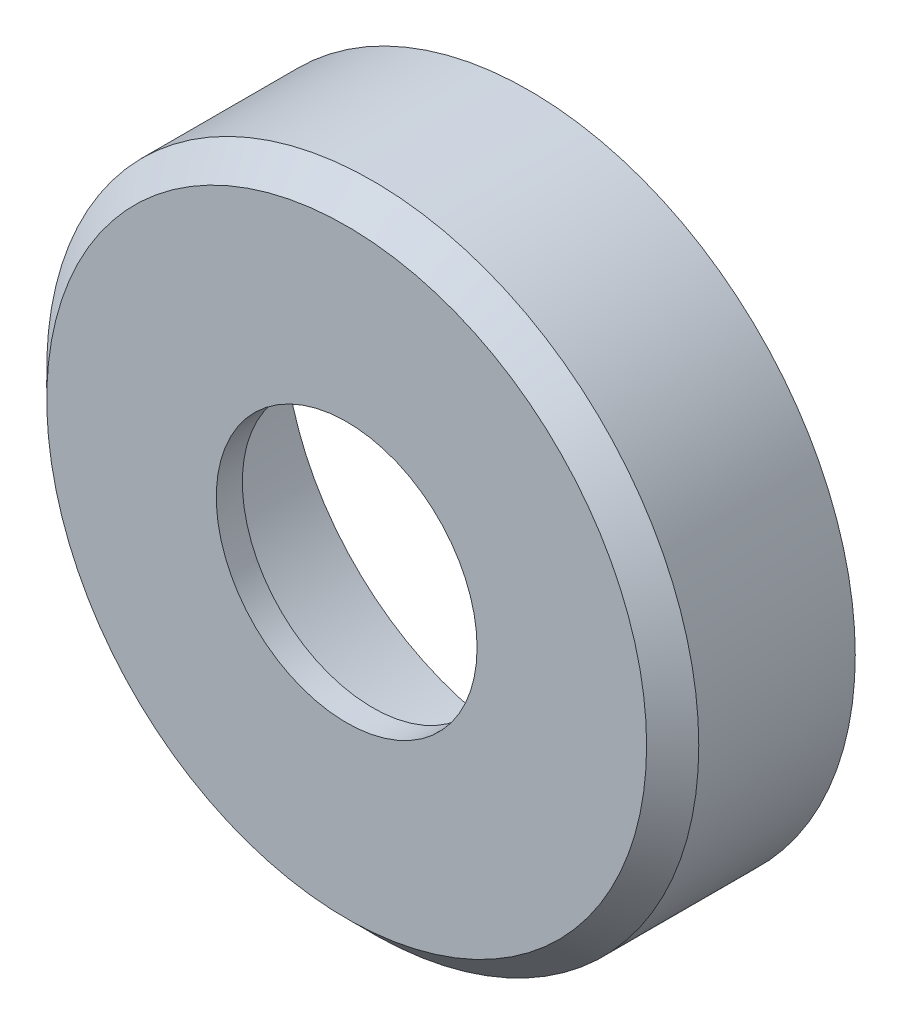
ISO-10303-21;
HEADER;
FILE_DESCRIPTION(('STEP AP214'),'2;1');
FILE_NAME('part.step','',(''),(''),'','','');
FILE_SCHEMA(('AUTOMOTIVE_DESIGN { 1 0 10303 214 1 1 1 1 }'));
ENDSEC;
DATA;
#1=APPLICATION_CONTEXT('core data for automotive mechanical design processes');
#2=APPLICATION_PROTOCOL_DEFINITION('international standard','automotive_design',2000,#1);
#3=PRODUCT_CONTEXT('',#1,'mechanical');
#4=PRODUCT('Part','Part','',(#3));
#5=PRODUCT_RELATED_PRODUCT_CATEGORY('part','',(#4));
#6=PRODUCT_DEFINITION_FORMATION('','',#4);
#7=PRODUCT_DEFINITION_CONTEXT('part definition',#1,'design');
#8=PRODUCT_DEFINITION('design','',#6,#7);
#9=PRODUCT_DEFINITION_SHAPE('','',#8);
#10=(LENGTH_UNIT() NAMED_UNIT(*) SI_UNIT(.MILLI.,.METRE.));
#11=(NAMED_UNIT(*) PLANE_ANGLE_UNIT() SI_UNIT($,.RADIAN.));
#12=(NAMED_UNIT(*) SI_UNIT($,.STERADIAN.) SOLID_ANGLE_UNIT());
#13=UNCERTAINTY_MEASURE_WITH_UNIT(LENGTH_MEASURE(1.E-05),#10,'distance_accuracy_value','');
#14=(GEOMETRIC_REPRESENTATION_CONTEXT(3) GLOBAL_UNCERTAINTY_ASSIGNED_CONTEXT((#13)) GLOBAL_UNIT_ASSIGNED_CONTEXT((#10,
#11,#12)) REPRESENTATION_CONTEXT('',''));
#15=CARTESIAN_POINT('',(0.,0.,0.));
#16=DIRECTION('',(0.,0.,1.));
#17=DIRECTION('',(1.,0.,0.));
#18=AXIS2_PLACEMENT_3D('',#15,#16,#17);
#19=CARTESIAN_POINT('',(0.,0.,0.));
#20=DIRECTION('',(0.,0.,1.));
#21=DIRECTION('',(1.,0.,0.));
#22=AXIS2_PLACEMENT_3D('',#19,#20,#21);
#23=PLANE('',#22);
#24=CARTESIAN_POINT('',(0.,0.,0.));
#25=DIRECTION('',(0.,0.,1.));
#26=DIRECTION('',(1.,0.,0.));
#27=AXIS2_PLACEMENT_3D('',#24,#25,#26);
#28=CIRCLE('',#27,12.5);
#29=CARTESIAN_POINT('',(12.5,0.,0.));
#30=VERTEX_POINT('',#29);
#31=EDGE_CURVE('E43',#30,#30,#28,.T.);
#32=ORIENTED_EDGE('',*,*,#31,.F.);
#33=EDGE_LOOP('',(#32));
#34=FACE_BOUND('',#33,.T.);
#35=CARTESIAN_POINT('',(0.,0.,0.));
#36=DIRECTION('',(0.,0.,1.));
#37=DIRECTION('',(1.,0.,0.));
#38=AXIS2_PLACEMENT_3D('',#35,#36,#37);
#39=CIRCLE('',#38,9.4);
#40=CARTESIAN_POINT('',(9.4,0.,0.));
#41=VERTEX_POINT('',#40);
#42=EDGE_CURVE('E47',#41,#41,#39,.T.);
#43=ORIENTED_EDGE('',*,*,#42,.T.);
#44=EDGE_LOOP('',(#43));
#45=FACE_BOUND('',#44,.T.);
#46=ADVANCED_FACE('F32',(#34,#45),#23,.F.);
#47=CARTESIAN_POINT('',(0.,0.,6.));
#48=DIRECTION('',(0.,0.,-1.));
#49=DIRECTION('',(-1.,0.,0.));
#50=AXIS2_PLACEMENT_3D('',#47,#48,#49);
#51=CYLINDRICAL_SURFACE('',#50,12.5);
#52=CARTESIAN_POINT('',(0.,0.,5.99999999999999));
#53=DIRECTION('',(0.,0.,1.));
#54=DIRECTION('',(1.,0.,0.));
#55=AXIS2_PLACEMENT_3D('',#52,#53,#54);
#56=CIRCLE('',#55,12.5);
#57=CARTESIAN_POINT('',(12.5,0.,5.99999999999999));
#58=VERTEX_POINT('',#57);
#59=EDGE_CURVE('E10',#58,#58,#56,.F.);
#60=ORIENTED_EDGE('',*,*,#59,.T.);
#61=EDGE_LOOP('',(#60));
#62=FACE_BOUND('',#61,.T.);
#63=ORIENTED_EDGE('',*,*,#31,.T.);
#64=EDGE_LOOP('',(#63));
#65=FACE_BOUND('',#64,.T.);
#66=ADVANCED_FACE('F78',(#62,#65),#51,.T.);
#67=CARTESIAN_POINT('',(0.,0.,6.));
#68=DIRECTION('',(0.,0.,-1.));
#69=DIRECTION('',(-1.,0.,0.));
#70=AXIS2_PLACEMENT_3D('',#67,#68,#69);
#71=CYLINDRICAL_SURFACE('',#70,9.4);
#72=CARTESIAN_POINT('',(0.,0.,6.));
#73=DIRECTION('',(0.,0.,1.));
#74=DIRECTION('',(1.,0.,0.));
#75=AXIS2_PLACEMENT_3D('',#72,#73,#74);
#76=CIRCLE('',#75,9.4);
#77=CARTESIAN_POINT('',(9.4,0.,6.));
#78=VERTEX_POINT('',#77);
#79=EDGE_CURVE('E52',#78,#78,#76,.T.);
#80=ORIENTED_EDGE('',*,*,#79,.T.);
#81=EDGE_LOOP('',(#80));
#82=FACE_BOUND('',#81,.T.);
#83=ORIENTED_EDGE('',*,*,#42,.F.);
#84=EDGE_LOOP('',(#83));
#85=FACE_BOUND('',#84,.T.);
#86=ADVANCED_FACE('F74',(#82,#85),#71,.F.);
#87=CARTESIAN_POINT('',(0.,0.,6.));
#88=DIRECTION('',(0.,0.,1.));
#89=DIRECTION('',(1.,0.,0.));
#90=AXIS2_PLACEMENT_3D('',#87,#88,#89);
#91=PLANE('',#90);
#92=CARTESIAN_POINT('',(0.,0.,6.));
#93=DIRECTION('',(0.,0.,1.));
#94=DIRECTION('',(1.,0.,0.));
#95=AXIS2_PLACEMENT_3D('',#92,#93,#94);
#96=CIRCLE('',#95,5.);
#97=CARTESIAN_POINT('',(5.,0.,6.));
#98=VERTEX_POINT('',#97);
#99=EDGE_CURVE('E56',#98,#98,#96,.T.);
#100=ORIENTED_EDGE('',*,*,#99,.T.);
#101=EDGE_LOOP('',(#100));
#102=FACE_BOUND('',#101,.T.);
#103=ORIENTED_EDGE('',*,*,#79,.F.);
#104=EDGE_LOOP('',(#103));
#105=FACE_BOUND('',#104,.T.);
#106=ADVANCED_FACE('F67',(#102,#105),#91,.F.);
#107=CARTESIAN_POINT('',(0.,0.,7.));
#108=DIRECTION('',(0.,0.,1.));
#109=DIRECTION('',(1.,0.,0.));
#110=AXIS2_PLACEMENT_3D('',#107,#108,#109);
#111=PLANE('',#110);
#112=CARTESIAN_POINT('',(0.,0.,7.));
#113=DIRECTION('',(0.,0.,1.));
#114=DIRECTION('',(1.,0.,0.));
#115=AXIS2_PLACEMENT_3D('',#112,#113,#114);
#116=CIRCLE('',#115,11.5);
#117=CARTESIAN_POINT('',(11.5,0.,7.));
#118=VERTEX_POINT('',#117);
#119=EDGE_CURVE('E39',#118,#118,#116,.T.);
#120=ORIENTED_EDGE('',*,*,#119,.T.);
#121=EDGE_LOOP('',(#120));
#122=FACE_BOUND('',#121,.T.);
#123=CARTESIAN_POINT('',(0.,0.,7.));
#124=DIRECTION('',(0.,0.,1.));
#125=DIRECTION('',(1.,0.,0.));
#126=AXIS2_PLACEMENT_3D('',#123,#124,#125);
#127=CIRCLE('',#126,5.);
#128=CARTESIAN_POINT('',(5.,0.,7.));
#129=VERTEX_POINT('',#128);
#130=EDGE_CURVE('E55',#129,#129,#127,.T.);
#131=ORIENTED_EDGE('',*,*,#130,.F.);
#132=EDGE_LOOP('',(#131));
#133=FACE_BOUND('',#132,.T.);
#134=ADVANCED_FACE('F65',(#122,#133),#111,.T.);
#135=CARTESIAN_POINT('',(0.,0.,7.));
#136=DIRECTION('',(0.,0.,-1.));
#137=DIRECTION('',(-1.,0.,0.));
#138=AXIS2_PLACEMENT_3D('',#135,#136,#137);
#139=CYLINDRICAL_SURFACE('',#138,5.);
#140=ORIENTED_EDGE('',*,*,#130,.T.);
#141=EDGE_LOOP('',(#140));
#142=FACE_BOUND('',#141,.T.);
#143=ORIENTED_EDGE('',*,*,#99,.F.);
#144=EDGE_LOOP('',(#143));
#145=FACE_BOUND('',#144,.T.);
#146=ADVANCED_FACE('F62',(#142,#145),#139,.F.);
#147=CARTESIAN_POINT('',(0.,0.,7.));
#148=DIRECTION('',(0.,0.,-1.));
#149=DIRECTION('',(-1.,0.,0.));
#150=AXIS2_PLACEMENT_3D('',#147,#148,#149);
#151=CONICAL_SURFACE('',#150,11.5,0.785398163397447);
#152=ORIENTED_EDGE('',*,*,#59,.F.);
#153=EDGE_LOOP('',(#152));
#154=FACE_BOUND('',#153,.T.);
#155=ORIENTED_EDGE('',*,*,#119,.F.);
#156=EDGE_LOOP('',(#155));
#157=FACE_BOUND('',#156,.T.);
#158=ADVANCED_FACE('F34',(#154,#157),#151,.T.);
#159=CLOSED_SHELL('',(#46,#66,#86,#106,#134,#146,#158));
#160=MANIFOLD_SOLID_BREP('B2',#159);
#161=ADVANCED_BREP_SHAPE_REPRESENTATION('',(#18,#160),#14);
#162=SHAPE_DEFINITION_REPRESENTATION(#9,#161);
ENDSEC;
END-ISO-10303-21;
